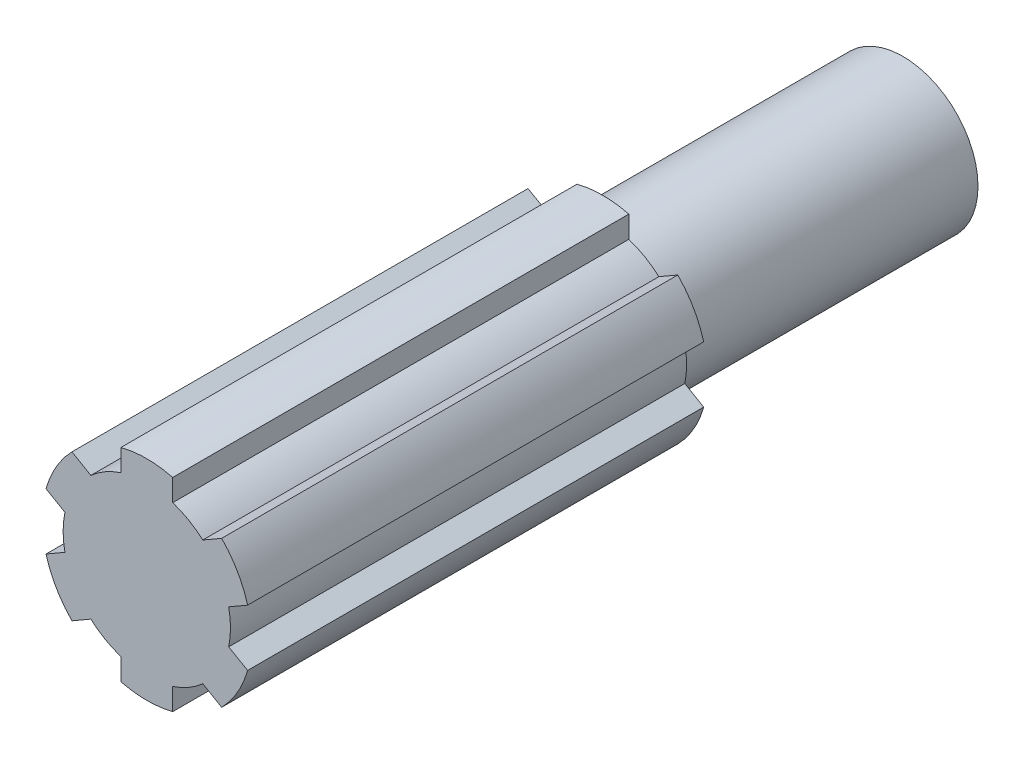
ISO-10303-21;
HEADER;
FILE_DESCRIPTION(('STEP AP214'),'2;1');
FILE_NAME('part.step','',(''),(''),'','','');
FILE_SCHEMA(('AUTOMOTIVE_DESIGN { 1 0 10303 214 1 1 1 1 }'));
ENDSEC;
DATA;
#1=APPLICATION_CONTEXT('core data for automotive mechanical design processes');
#2=APPLICATION_PROTOCOL_DEFINITION('international standard','automotive_design',2000,#1);
#3=PRODUCT_CONTEXT('',#1,'mechanical');
#4=PRODUCT('Part','Part','',(#3));
#5=PRODUCT_RELATED_PRODUCT_CATEGORY('part','',(#4));
#6=PRODUCT_DEFINITION_FORMATION('','',#4);
#7=PRODUCT_DEFINITION_CONTEXT('part definition',#1,'design');
#8=PRODUCT_DEFINITION('design','',#6,#7);
#9=PRODUCT_DEFINITION_SHAPE('','',#8);
#10=(LENGTH_UNIT() NAMED_UNIT(*) SI_UNIT(.MILLI.,.METRE.));
#11=(NAMED_UNIT(*) PLANE_ANGLE_UNIT() SI_UNIT($,.RADIAN.));
#12=(NAMED_UNIT(*) SI_UNIT($,.STERADIAN.) SOLID_ANGLE_UNIT());
#13=UNCERTAINTY_MEASURE_WITH_UNIT(LENGTH_MEASURE(1.E-05),#10,'distance_accuracy_value','');
#14=(GEOMETRIC_REPRESENTATION_CONTEXT(3) GLOBAL_UNCERTAINTY_ASSIGNED_CONTEXT((#13)) GLOBAL_UNIT_ASSIGNED_CONTEXT((#10,
#11,#12)) REPRESENTATION_CONTEXT('',''));
#15=CARTESIAN_POINT('',(0.,0.,0.));
#16=DIRECTION('',(0.,0.,1.));
#17=DIRECTION('',(1.,0.,0.));
#18=AXIS2_PLACEMENT_3D('',#15,#16,#17);
#19=CARTESIAN_POINT('',(0.,0.,50.));
#20=DIRECTION('',(0.,0.,-1.));
#21=DIRECTION('',(-1.,0.,0.));
#22=AXIS2_PLACEMENT_3D('',#19,#20,#21);
#23=CYLINDRICAL_SURFACE('',#22,12.5);
#24=CARTESIAN_POINT('',(0.,0.,50.));
#25=DIRECTION('',(0.,0.,1.));
#26=DIRECTION('',(1.,0.,0.));
#27=AXIS2_PLACEMENT_3D('',#24,#25,#26);
#28=CIRCLE('',#27,12.5);
#29=CARTESIAN_POINT('',(12.5,0.,50.));
#30=VERTEX_POINT('',#29);
#31=EDGE_CURVE('E11',#30,#30,#28,.T.);
#32=ORIENTED_EDGE('',*,*,#31,.F.);
#33=EDGE_LOOP('',(#32));
#34=FACE_BOUND('',#33,.T.);
#35=CARTESIAN_POINT('',(0.,0.,0.));
#36=DIRECTION('',(0.,0.,1.));
#37=DIRECTION('',(1.,0.,0.));
#38=AXIS2_PLACEMENT_3D('',#35,#36,#37);
#39=CIRCLE('',#38,12.5);
#40=CARTESIAN_POINT('',(12.5,0.,0.));
#41=VERTEX_POINT('',#40);
#42=EDGE_CURVE('E36',#41,#41,#39,.T.);
#43=ORIENTED_EDGE('',*,*,#42,.T.);
#44=EDGE_LOOP('',(#43));
#45=FACE_BOUND('',#44,.T.);
#46=ADVANCED_FACE('F33',(#34,#45),#23,.T.);
#47=CARTESIAN_POINT('',(0.,0.,0.));
#48=DIRECTION('',(0.,0.,1.));
#49=DIRECTION('',(1.,0.,0.));
#50=AXIS2_PLACEMENT_3D('',#47,#48,#49);
#51=PLANE('',#50);
#52=ORIENTED_EDGE('',*,*,#42,.F.);
#53=EDGE_LOOP('',(#52));
#54=FACE_BOUND('',#53,.T.);
#55=ADVANCED_FACE('F339',(#54),#51,.F.);
#56=CARTESIAN_POINT('',(0.,0.,126.));
#57=DIRECTION('',(0.,0.,-1.));
#58=DIRECTION('',(-1.,0.,0.));
#59=AXIS2_PLACEMENT_3D('',#56,#57,#58);
#60=CYLINDRICAL_SURFACE('',#59,13.945);
#61=CARTESIAN_POINT('',(0.,0.,50.));
#62=DIRECTION('',(0.,0.,1.));
#63=DIRECTION('',(1.,0.,0.));
#64=AXIS2_PLACEMENT_3D('',#61,#62,#63);
#65=CIRCLE('',#64,13.945);
#66=CARTESIAN_POINT('',(9.32261593671059,10.3707211464097,50.));
#67=VERTEX_POINT('',#66);
#68=CARTESIAN_POINT('',(4.32,13.2589828041219,50.));
#69=VERTEX_POINT('',#68);
#70=EDGE_CURVE('E226',#67,#69,#65,.T.);
#71=ORIENTED_EDGE('',*,*,#70,.T.);
#72=DIRECTION('',(0.,0.,-1.));
#73=VECTOR('',#72,1.);
#74=CARTESIAN_POINT('',(4.32,13.2589828041219,126.));
#75=LINE('',#74,#73);
#76=CARTESIAN_POINT('',(4.32,13.2589828041219,126.));
#77=VERTEX_POINT('',#76);
#78=EDGE_CURVE('E333',#77,#69,#75,.T.);
#79=ORIENTED_EDGE('',*,*,#78,.F.);
#80=CARTESIAN_POINT('',(0.,0.,126.));
#81=DIRECTION('',(0.,0.,1.));
#82=DIRECTION('',(1.,0.,0.));
#83=AXIS2_PLACEMENT_3D('',#80,#81,#82);
#84=CIRCLE('',#83,13.945);
#85=CARTESIAN_POINT('',(9.32261593671059,10.3707211464097,126.));
#86=VERTEX_POINT('',#85);
#87=EDGE_CURVE('E272',#86,#77,#84,.T.);
#88=ORIENTED_EDGE('',*,*,#87,.F.);
#89=DIRECTION('',(0.,0.,-1.));
#90=VECTOR('',#89,1.);
#91=CARTESIAN_POINT('',(9.32261593671059,10.3707211464097,126.));
#92=LINE('',#91,#90);
#93=EDGE_CURVE('E222',#86,#67,#92,.T.);
#94=ORIENTED_EDGE('',*,*,#93,.T.);
#95=EDGE_LOOP('',(#71,#79,#88,#94));
#96=FACE_BOUND('',#95,.T.);
#97=ADVANCED_FACE('F341',(#96),#60,.T.);
#98=CARTESIAN_POINT('',(4.32,16.9016456299379,126.));
#99=DIRECTION('',(-1.,0.,0.));
#100=DIRECTION('',(0.,-1.,0.));
#101=AXIS2_PLACEMENT_3D('',#98,#99,#100);
#102=PLANE('',#101);
#103=DIRECTION('',(0.,1.,0.));
#104=VECTOR('',#103,1.);
#105=CARTESIAN_POINT('',(4.32,16.9016456299379,50.));
#106=LINE('',#105,#104);
#107=CARTESIAN_POINT('',(4.32,16.9016456299379,50.));
#108=VERTEX_POINT('',#107);
#109=EDGE_CURVE('E229',#69,#108,#106,.T.);
#110=ORIENTED_EDGE('',*,*,#109,.T.);
#111=DIRECTION('',(0.,0.,-1.));
#112=VECTOR('',#111,1.);
#113=CARTESIAN_POINT('',(4.32,16.9016456299379,126.));
#114=LINE('',#113,#112);
#115=CARTESIAN_POINT('',(4.32,16.9016456299379,126.));
#116=VERTEX_POINT('',#115);
#117=EDGE_CURVE('E330',#116,#108,#114,.T.);
#118=ORIENTED_EDGE('',*,*,#117,.F.);
#119=DIRECTION('',(0.,1.,0.));
#120=VECTOR('',#119,1.);
#121=CARTESIAN_POINT('',(4.32,16.9016456299379,126.));
#122=LINE('',#121,#120);
#123=EDGE_CURVE('E141',#77,#116,#122,.T.);
#124=ORIENTED_EDGE('',*,*,#123,.F.);
#125=ORIENTED_EDGE('',*,*,#78,.T.);
#126=EDGE_LOOP('',(#110,#118,#124,#125));
#127=FACE_BOUND('',#126,.T.);
#128=ADVANCED_FACE('F346',(#127),#102,.F.);
#129=CARTESIAN_POINT('',(0.,0.,126.));
#130=DIRECTION('',(0.,0.,-1.));
#131=DIRECTION('',(-1.,0.,0.));
#132=AXIS2_PLACEMENT_3D('',#129,#130,#131);
#133=CYLINDRICAL_SURFACE('',#132,17.445);
#134=CARTESIAN_POINT('',(0.,0.,50.));
#135=DIRECTION('',(0.,0.,1.));
#136=DIRECTION('',(1.,0.,0.));
#137=AXIS2_PLACEMENT_3D('',#134,#135,#136);
#138=CIRCLE('',#137,17.445);
#139=CARTESIAN_POINT('',(-4.32,16.9016456299379,50.));
#140=VERTEX_POINT('',#139);
#141=EDGE_CURVE('E231',#108,#140,#138,.T.);
#142=ORIENTED_EDGE('',*,*,#141,.T.);
#143=DIRECTION('',(0.,0.,-1.));
#144=VECTOR('',#143,1.);
#145=CARTESIAN_POINT('',(-4.32,16.9016456299379,126.));
#146=LINE('',#145,#144);
#147=CARTESIAN_POINT('',(-4.32,16.9016456299379,126.));
#148=VERTEX_POINT('',#147);
#149=EDGE_CURVE('E327',#148,#140,#146,.T.);
#150=ORIENTED_EDGE('',*,*,#149,.F.);
#151=CARTESIAN_POINT('',(0.,0.,126.));
#152=DIRECTION('',(0.,0.,1.));
#153=DIRECTION('',(1.,0.,0.));
#154=AXIS2_PLACEMENT_3D('',#151,#152,#153);
#155=CIRCLE('',#154,17.445);
#156=EDGE_CURVE('E613',#116,#148,#155,.T.);
#157=ORIENTED_EDGE('',*,*,#156,.F.);
#158=ORIENTED_EDGE('',*,*,#117,.T.);
#159=EDGE_LOOP('',(#142,#150,#157,#158));
#160=FACE_BOUND('',#159,.T.);
#161=ADVANCED_FACE('F353',(#160),#133,.T.);
#162=CARTESIAN_POINT('',(-4.32,13.2589828041219,126.));
#163=DIRECTION('',(1.,0.,0.));
#164=DIRECTION('',(0.,0.,-1.));
#165=AXIS2_PLACEMENT_3D('',#162,#163,#164);
#166=PLANE('',#165);
#167=DIRECTION('',(0.,-1.,0.));
#168=VECTOR('',#167,1.);
#169=CARTESIAN_POINT('',(-4.32,13.2589828041219,50.));
#170=LINE('',#169,#168);
#171=CARTESIAN_POINT('',(-4.32,13.2589828041219,50.));
#172=VERTEX_POINT('',#171);
#173=EDGE_CURVE('E233',#140,#172,#170,.T.);
#174=ORIENTED_EDGE('',*,*,#173,.T.);
#175=DIRECTION('',(0.,0.,-1.));
#176=VECTOR('',#175,1.);
#177=CARTESIAN_POINT('',(-4.32,13.2589828041219,126.));
#178=LINE('',#177,#176);
#179=CARTESIAN_POINT('',(-4.32,13.2589828041219,126.));
#180=VERTEX_POINT('',#179);
#181=EDGE_CURVE('E324',#180,#172,#178,.T.);
#182=ORIENTED_EDGE('',*,*,#181,.F.);
#183=DIRECTION('',(0.,-1.,0.));
#184=VECTOR('',#183,1.);
#185=CARTESIAN_POINT('',(-4.32,13.2589828041219,126.));
#186=LINE('',#185,#184);
#187=EDGE_CURVE('E617',#148,#180,#186,.T.);
#188=ORIENTED_EDGE('',*,*,#187,.F.);
#189=ORIENTED_EDGE('',*,*,#149,.T.);
#190=EDGE_LOOP('',(#174,#182,#188,#189));
#191=FACE_BOUND('',#190,.T.);
#192=ADVANCED_FACE('F356',(#191),#166,.F.);
#193=CARTESIAN_POINT('',(0.,0.,126.));
#194=DIRECTION('',(0.,0.,-1.));
#195=DIRECTION('',(-1.,0.,0.));
#196=AXIS2_PLACEMENT_3D('',#193,#194,#195);
#197=CYLINDRICAL_SURFACE('',#196,13.945);
#198=CARTESIAN_POINT('',(0.,0.,50.));
#199=DIRECTION('',(0.,0.,1.));
#200=DIRECTION('',(1.,0.,0.));
#201=AXIS2_PLACEMENT_3D('',#198,#199,#200);
#202=CIRCLE('',#201,13.945);
#203=CARTESIAN_POINT('',(-9.3226159367106,10.3707211464097,50.));
#204=VERTEX_POINT('',#203);
#205=EDGE_CURVE('E235',#172,#204,#202,.T.);
#206=ORIENTED_EDGE('',*,*,#205,.T.);
#207=DIRECTION('',(0.,0.,-1.));
#208=VECTOR('',#207,1.);
#209=CARTESIAN_POINT('',(-9.3226159367106,10.3707211464097,126.));
#210=LINE('',#209,#208);
#211=CARTESIAN_POINT('',(-9.3226159367106,10.3707211464097,126.));
#212=VERTEX_POINT('',#211);
#213=EDGE_CURVE('E321',#212,#204,#210,.T.);
#214=ORIENTED_EDGE('',*,*,#213,.F.);
#215=CARTESIAN_POINT('',(0.,0.,126.));
#216=DIRECTION('',(0.,0.,1.));
#217=DIRECTION('',(1.,0.,0.));
#218=AXIS2_PLACEMENT_3D('',#215,#216,#217);
#219=CIRCLE('',#218,13.945);
#220=EDGE_CURVE('E619',#180,#212,#219,.T.);
#221=ORIENTED_EDGE('',*,*,#220,.F.);
#222=ORIENTED_EDGE('',*,*,#181,.T.);
#223=EDGE_LOOP('',(#206,#214,#221,#222));
#224=FACE_BOUND('',#223,.T.);
#225=ADVANCED_FACE('F360',(#224),#197,.T.);
#226=CARTESIAN_POINT('',(-12.4772544812885,12.1920525593178,126.));
#227=DIRECTION('',(-0.500000000000008,-0.866025403784434,0.));
#228=DIRECTION('',(0.866025403784434,-0.500000000000008,0.));
#229=AXIS2_PLACEMENT_3D('',#226,#227,#228);
#230=PLANE('',#229);
#231=DIRECTION('',(-0.866025403784434,0.500000000000008,0.));
#232=VECTOR('',#231,1.);
#233=CARTESIAN_POINT('',(-12.4772544812885,12.1920525593178,50.));
#234=LINE('',#233,#232);
#235=CARTESIAN_POINT('',(-12.4772544812885,12.1920525593178,50.));
#236=VERTEX_POINT('',#235);
#237=EDGE_CURVE('E237',#204,#236,#234,.T.);
#238=ORIENTED_EDGE('',*,*,#237,.T.);
#239=DIRECTION('',(0.,0.,-1.));
#240=VECTOR('',#239,1.);
#241=CARTESIAN_POINT('',(-12.4772544812885,12.1920525593178,126.));
#242=LINE('',#241,#240);
#243=CARTESIAN_POINT('',(-12.4772544812885,12.1920525593178,126.));
#244=VERTEX_POINT('',#243);
#245=EDGE_CURVE('E318',#244,#236,#242,.T.);
#246=ORIENTED_EDGE('',*,*,#245,.F.);
#247=DIRECTION('',(-0.866025403784434,0.500000000000008,0.));
#248=VECTOR('',#247,1.);
#249=CARTESIAN_POINT('',(-12.4772544812885,12.1920525593178,126.));
#250=LINE('',#249,#248);
#251=EDGE_CURVE('E621',#212,#244,#250,.T.);
#252=ORIENTED_EDGE('',*,*,#251,.F.);
#253=ORIENTED_EDGE('',*,*,#213,.T.);
#254=EDGE_LOOP('',(#238,#246,#252,#253));
#255=FACE_BOUND('',#254,.T.);
#256=ADVANCED_FACE('F364',(#255),#230,.F.);
#257=CARTESIAN_POINT('',(0.,0.,126.));
#258=DIRECTION('',(0.,0.,-1.));
#259=DIRECTION('',(-1.,0.,0.));
#260=AXIS2_PLACEMENT_3D('',#257,#258,#259);
#261=CYLINDRICAL_SURFACE('',#260,17.445);
#262=CARTESIAN_POINT('',(0.,0.,50.));
#263=DIRECTION('',(0.,0.,1.));
#264=DIRECTION('',(1.,0.,0.));
#265=AXIS2_PLACEMENT_3D('',#262,#263,#264);
#266=CIRCLE('',#265,17.445);
#267=CARTESIAN_POINT('',(-16.7972544812885,4.70959307062018,50.));
#268=VERTEX_POINT('',#267);
#269=EDGE_CURVE('E239',#236,#268,#266,.T.);
#270=ORIENTED_EDGE('',*,*,#269,.T.);
#271=DIRECTION('',(0.,0.,-1.));
#272=VECTOR('',#271,1.);
#273=CARTESIAN_POINT('',(-16.7972544812885,4.70959307062018,126.));
#274=LINE('',#273,#272);
#275=CARTESIAN_POINT('',(-16.7972544812885,4.70959307062018,126.));
#276=VERTEX_POINT('',#275);
#277=EDGE_CURVE('E315',#276,#268,#274,.T.);
#278=ORIENTED_EDGE('',*,*,#277,.F.);
#279=CARTESIAN_POINT('',(0.,0.,126.));
#280=DIRECTION('',(0.,0.,1.));
#281=DIRECTION('',(1.,0.,0.));
#282=AXIS2_PLACEMENT_3D('',#279,#280,#281);
#283=CIRCLE('',#282,17.445);
#284=EDGE_CURVE('E623',#244,#276,#283,.T.);
#285=ORIENTED_EDGE('',*,*,#284,.F.);
#286=ORIENTED_EDGE('',*,*,#245,.T.);
#287=EDGE_LOOP('',(#270,#278,#285,#286));
#288=FACE_BOUND('',#287,.T.);
#289=ADVANCED_FACE('F368',(#288),#261,.T.);
#290=CARTESIAN_POINT('',(-13.6426159367106,2.88826165771216,126.));
#291=DIRECTION('',(0.499999999999999,0.866025403784439,0.));
#292=DIRECTION('',(-0.866025403784439,0.499999999999999,0.));
#293=AXIS2_PLACEMENT_3D('',#290,#291,#292);
#294=PLANE('',#293);
#295=DIRECTION('',(0.866025403784439,-0.499999999999999,0.));
#296=VECTOR('',#295,1.);
#297=CARTESIAN_POINT('',(-13.6426159367106,2.88826165771216,50.));
#298=LINE('',#297,#296);
#299=CARTESIAN_POINT('',(-13.6426159367106,2.88826165771216,50.));
#300=VERTEX_POINT('',#299);
#301=EDGE_CURVE('E241',#268,#300,#298,.T.);
#302=ORIENTED_EDGE('',*,*,#301,.T.);
#303=DIRECTION('',(0.,0.,-1.));
#304=VECTOR('',#303,1.);
#305=CARTESIAN_POINT('',(-13.6426159367106,2.88826165771216,126.));
#306=LINE('',#305,#304);
#307=CARTESIAN_POINT('',(-13.6426159367106,2.88826165771216,126.));
#308=VERTEX_POINT('',#307);
#309=EDGE_CURVE('E312',#308,#300,#306,.T.);
#310=ORIENTED_EDGE('',*,*,#309,.F.);
#311=DIRECTION('',(0.866025403784439,-0.499999999999999,0.));
#312=VECTOR('',#311,1.);
#313=CARTESIAN_POINT('',(-13.6426159367106,2.88826165771216,126.));
#314=LINE('',#313,#312);
#315=EDGE_CURVE('E625',#276,#308,#314,.T.);
#316=ORIENTED_EDGE('',*,*,#315,.F.);
#317=ORIENTED_EDGE('',*,*,#277,.T.);
#318=EDGE_LOOP('',(#302,#310,#316,#317));
#319=FACE_BOUND('',#318,.T.);
#320=ADVANCED_FACE('F372',(#319),#294,.F.);
#321=CARTESIAN_POINT('',(0.,0.,126.));
#322=DIRECTION('',(0.,0.,-1.));
#323=DIRECTION('',(-1.,0.,0.));
#324=AXIS2_PLACEMENT_3D('',#321,#322,#323);
#325=CYLINDRICAL_SURFACE('',#324,13.945);
#326=CARTESIAN_POINT('',(0.,0.,50.));
#327=DIRECTION('',(0.,0.,1.));
#328=DIRECTION('',(1.,0.,0.));
#329=AXIS2_PLACEMENT_3D('',#326,#327,#328);
#330=CIRCLE('',#329,13.945);
#331=CARTESIAN_POINT('',(-13.6426159367106,-2.88826165771218,50.));
#332=VERTEX_POINT('',#331);
#333=EDGE_CURVE('E243',#300,#332,#330,.T.);
#334=ORIENTED_EDGE('',*,*,#333,.T.);
#335=DIRECTION('',(0.,0.,-1.));
#336=VECTOR('',#335,1.);
#337=CARTESIAN_POINT('',(-13.6426159367106,-2.88826165771218,126.));
#338=LINE('',#337,#336);
#339=CARTESIAN_POINT('',(-13.6426159367106,-2.88826165771218,126.));
#340=VERTEX_POINT('',#339);
#341=EDGE_CURVE('E309',#340,#332,#338,.T.);
#342=ORIENTED_EDGE('',*,*,#341,.F.);
#343=CARTESIAN_POINT('',(0.,0.,126.));
#344=DIRECTION('',(0.,0.,1.));
#345=DIRECTION('',(1.,0.,0.));
#346=AXIS2_PLACEMENT_3D('',#343,#344,#345);
#347=CIRCLE('',#346,13.945);
#348=EDGE_CURVE('E627',#308,#340,#347,.T.);
#349=ORIENTED_EDGE('',*,*,#348,.F.);
#350=ORIENTED_EDGE('',*,*,#309,.T.);
#351=EDGE_LOOP('',(#334,#342,#349,#350));
#352=FACE_BOUND('',#351,.T.);
#353=ADVANCED_FACE('F376',(#352),#325,.T.);
#354=CARTESIAN_POINT('',(-16.7972544812885,-4.7095930706202,126.));
#355=DIRECTION('',(0.499999999999999,-0.866025403784439,0.));
#356=DIRECTION('',(0.866025403784439,0.499999999999999,0.));
#357=AXIS2_PLACEMENT_3D('',#354,#355,#356);
#358=PLANE('',#357);
#359=DIRECTION('',(-0.866025403784439,-0.499999999999999,0.));
#360=VECTOR('',#359,1.);
#361=CARTESIAN_POINT('',(-16.7972544812885,-4.7095930706202,50.));
#362=LINE('',#361,#360);
#363=CARTESIAN_POINT('',(-16.7972544812885,-4.70959307062019,50.));
#364=VERTEX_POINT('',#363);
#365=EDGE_CURVE('E245',#332,#364,#362,.T.);
#366=ORIENTED_EDGE('',*,*,#365,.T.);
#367=DIRECTION('',(0.,0.,-1.));
#368=VECTOR('',#367,1.);
#369=CARTESIAN_POINT('',(-16.7972544812885,-4.70959307062019,126.));
#370=LINE('',#369,#368);
#371=CARTESIAN_POINT('',(-16.7972544812885,-4.70959307062019,126.));
#372=VERTEX_POINT('',#371);
#373=EDGE_CURVE('E306',#372,#364,#370,.T.);
#374=ORIENTED_EDGE('',*,*,#373,.F.);
#375=DIRECTION('',(-0.866025403784439,-0.499999999999999,0.));
#376=VECTOR('',#375,1.);
#377=CARTESIAN_POINT('',(-16.7972544812885,-4.7095930706202,126.));
#378=LINE('',#377,#376);
#379=EDGE_CURVE('E629',#340,#372,#378,.T.);
#380=ORIENTED_EDGE('',*,*,#379,.F.);
#381=ORIENTED_EDGE('',*,*,#341,.T.);
#382=EDGE_LOOP('',(#366,#374,#380,#381));
#383=FACE_BOUND('',#382,.T.);
#384=ADVANCED_FACE('F380',(#383),#358,.F.);
#385=CARTESIAN_POINT('',(0.,0.,126.));
#386=DIRECTION('',(0.,0.,-1.));
#387=DIRECTION('',(-1.,0.,0.));
#388=AXIS2_PLACEMENT_3D('',#385,#386,#387);
#389=CYLINDRICAL_SURFACE('',#388,17.445);
#390=CARTESIAN_POINT('',(0.,0.,50.));
#391=DIRECTION('',(0.,0.,1.));
#392=DIRECTION('',(1.,0.,0.));
#393=AXIS2_PLACEMENT_3D('',#390,#391,#392);
#394=CIRCLE('',#393,17.445);
#395=CARTESIAN_POINT('',(-12.4772544812885,-12.1920525593177,50.));
#396=VERTEX_POINT('',#395);
#397=EDGE_CURVE('E247',#364,#396,#394,.T.);
#398=ORIENTED_EDGE('',*,*,#397,.T.);
#399=DIRECTION('',(0.,0.,-1.));
#400=VECTOR('',#399,1.);
#401=CARTESIAN_POINT('',(-12.4772544812885,-12.1920525593177,126.));
#402=LINE('',#401,#400);
#403=CARTESIAN_POINT('',(-12.4772544812885,-12.1920525593177,126.));
#404=VERTEX_POINT('',#403);
#405=EDGE_CURVE('E303',#404,#396,#402,.T.);
#406=ORIENTED_EDGE('',*,*,#405,.F.);
#407=CARTESIAN_POINT('',(0.,0.,126.));
#408=DIRECTION('',(0.,0.,1.));
#409=DIRECTION('',(1.,0.,0.));
#410=AXIS2_PLACEMENT_3D('',#407,#408,#409);
#411=CIRCLE('',#410,17.445);
#412=EDGE_CURVE('E631',#372,#404,#411,.T.);
#413=ORIENTED_EDGE('',*,*,#412,.F.);
#414=ORIENTED_EDGE('',*,*,#373,.T.);
#415=EDGE_LOOP('',(#398,#406,#413,#414));
#416=FACE_BOUND('',#415,.T.);
#417=ADVANCED_FACE('F384',(#416),#389,.T.);
#418=CARTESIAN_POINT('',(-9.32261593671059,-10.3707211464097,126.));
#419=DIRECTION('',(-0.500000000000001,0.866025403784438,0.));
#420=DIRECTION('',(-0.866025403784438,-0.500000000000001,0.));
#421=AXIS2_PLACEMENT_3D('',#418,#419,#420);
#422=PLANE('',#421);
#423=DIRECTION('',(0.866025403784438,0.500000000000001,0.));
#424=VECTOR('',#423,1.);
#425=CARTESIAN_POINT('',(-9.32261593671059,-10.3707211464097,50.));
#426=LINE('',#425,#424);
#427=CARTESIAN_POINT('',(-9.32261593671059,-10.3707211464097,50.));
#428=VERTEX_POINT('',#427);
#429=EDGE_CURVE('E249',#396,#428,#426,.T.);
#430=ORIENTED_EDGE('',*,*,#429,.T.);
#431=DIRECTION('',(0.,0.,-1.));
#432=VECTOR('',#431,1.);
#433=CARTESIAN_POINT('',(-9.32261593671059,-10.3707211464097,126.));
#434=LINE('',#433,#432);
#435=CARTESIAN_POINT('',(-9.32261593671059,-10.3707211464097,126.));
#436=VERTEX_POINT('',#435);
#437=EDGE_CURVE('E300',#436,#428,#434,.T.);
#438=ORIENTED_EDGE('',*,*,#437,.F.);
#439=DIRECTION('',(0.866025403784438,0.500000000000001,0.));
#440=VECTOR('',#439,1.);
#441=CARTESIAN_POINT('',(-9.32261593671059,-10.3707211464097,126.));
#442=LINE('',#441,#440);
#443=EDGE_CURVE('E633',#404,#436,#442,.T.);
#444=ORIENTED_EDGE('',*,*,#443,.F.);
#445=ORIENTED_EDGE('',*,*,#405,.T.);
#446=EDGE_LOOP('',(#430,#438,#444,#445));
#447=FACE_BOUND('',#446,.T.);
#448=ADVANCED_FACE('F388',(#447),#422,.F.);
#449=CARTESIAN_POINT('',(0.,0.,126.));
#450=DIRECTION('',(0.,0.,-1.));
#451=DIRECTION('',(-1.,0.,0.));
#452=AXIS2_PLACEMENT_3D('',#449,#450,#451);
#453=CYLINDRICAL_SURFACE('',#452,13.945);
#454=CARTESIAN_POINT('',(0.,0.,50.));
#455=DIRECTION('',(0.,0.,1.));
#456=DIRECTION('',(1.,0.,0.));
#457=AXIS2_PLACEMENT_3D('',#454,#455,#456);
#458=CIRCLE('',#457,13.945);
#459=CARTESIAN_POINT('',(-4.31999999999999,-13.2589828041219,50.));
#460=VERTEX_POINT('',#459);
#461=EDGE_CURVE('E251',#428,#460,#458,.T.);
#462=ORIENTED_EDGE('',*,*,#461,.T.);
#463=DIRECTION('',(0.,0.,-1.));
#464=VECTOR('',#463,1.);
#465=CARTESIAN_POINT('',(-4.31999999999999,-13.2589828041219,126.));
#466=LINE('',#465,#464);
#467=CARTESIAN_POINT('',(-4.31999999999999,-13.2589828041219,126.));
#468=VERTEX_POINT('',#467);
#469=EDGE_CURVE('E297',#468,#460,#466,.T.);
#470=ORIENTED_EDGE('',*,*,#469,.F.);
#471=CARTESIAN_POINT('',(0.,0.,126.));
#472=DIRECTION('',(0.,0.,1.));
#473=DIRECTION('',(1.,0.,0.));
#474=AXIS2_PLACEMENT_3D('',#471,#472,#473);
#475=CIRCLE('',#474,13.945);
#476=EDGE_CURVE('E635',#436,#468,#475,.T.);
#477=ORIENTED_EDGE('',*,*,#476,.F.);
#478=ORIENTED_EDGE('',*,*,#437,.T.);
#479=EDGE_LOOP('',(#462,#470,#477,#478));
#480=FACE_BOUND('',#479,.T.);
#481=ADVANCED_FACE('F392',(#480),#453,.T.);
#482=CARTESIAN_POINT('',(-4.32,-16.9016456299379,126.));
#483=DIRECTION('',(1.,0.,0.));
#484=DIRECTION('',(0.,1.,0.));
#485=AXIS2_PLACEMENT_3D('',#482,#483,#484);
#486=PLANE('',#485);
#487=DIRECTION('',(0.,-1.,0.));
#488=VECTOR('',#487,1.);
#489=CARTESIAN_POINT('',(-4.32,-16.9016456299379,50.));
#490=LINE('',#489,#488);
#491=CARTESIAN_POINT('',(-4.32000000000001,-16.9016456299379,50.));
#492=VERTEX_POINT('',#491);
#493=EDGE_CURVE('E253',#460,#492,#490,.T.);
#494=ORIENTED_EDGE('',*,*,#493,.T.);
#495=DIRECTION('',(0.,0.,-1.));
#496=VECTOR('',#495,1.);
#497=CARTESIAN_POINT('',(-4.32000000000001,-16.9016456299379,126.));
#498=LINE('',#497,#496);
#499=CARTESIAN_POINT('',(-4.32000000000001,-16.9016456299379,126.));
#500=VERTEX_POINT('',#499);
#501=EDGE_CURVE('E294',#500,#492,#498,.T.);
#502=ORIENTED_EDGE('',*,*,#501,.F.);
#503=DIRECTION('',(0.,-1.,0.));
#504=VECTOR('',#503,1.);
#505=CARTESIAN_POINT('',(-4.32,-16.9016456299379,126.));
#506=LINE('',#505,#504);
#507=EDGE_CURVE('E637',#468,#500,#506,.T.);
#508=ORIENTED_EDGE('',*,*,#507,.F.);
#509=ORIENTED_EDGE('',*,*,#469,.T.);
#510=EDGE_LOOP('',(#494,#502,#508,#509));
#511=FACE_BOUND('',#510,.T.);
#512=ADVANCED_FACE('F396',(#511),#486,.F.);
#513=CARTESIAN_POINT('',(0.,0.,126.));
#514=DIRECTION('',(0.,0.,-1.));
#515=DIRECTION('',(-1.,0.,0.));
#516=AXIS2_PLACEMENT_3D('',#513,#514,#515);
#517=CYLINDRICAL_SURFACE('',#516,17.445);
#518=CARTESIAN_POINT('',(0.,0.,50.));
#519=DIRECTION('',(0.,0.,1.));
#520=DIRECTION('',(1.,0.,0.));
#521=AXIS2_PLACEMENT_3D('',#518,#519,#520);
#522=CIRCLE('',#521,17.445);
#523=CARTESIAN_POINT('',(4.32,-16.9016456299379,50.));
#524=VERTEX_POINT('',#523);
#525=EDGE_CURVE('E255',#492,#524,#522,.T.);
#526=ORIENTED_EDGE('',*,*,#525,.T.);
#527=DIRECTION('',(0.,0.,-1.));
#528=VECTOR('',#527,1.);
#529=CARTESIAN_POINT('',(4.32,-16.9016456299379,126.));
#530=LINE('',#529,#528);
#531=CARTESIAN_POINT('',(4.32,-16.9016456299379,126.));
#532=VERTEX_POINT('',#531);
#533=EDGE_CURVE('E291',#532,#524,#530,.T.);
#534=ORIENTED_EDGE('',*,*,#533,.F.);
#535=CARTESIAN_POINT('',(0.,0.,126.));
#536=DIRECTION('',(0.,0.,1.));
#537=DIRECTION('',(1.,0.,0.));
#538=AXIS2_PLACEMENT_3D('',#535,#536,#537);
#539=CIRCLE('',#538,17.445);
#540=EDGE_CURVE('E639',#500,#532,#539,.T.);
#541=ORIENTED_EDGE('',*,*,#540,.F.);
#542=ORIENTED_EDGE('',*,*,#501,.T.);
#543=EDGE_LOOP('',(#526,#534,#541,#542));
#544=FACE_BOUND('',#543,.T.);
#545=ADVANCED_FACE('F400',(#544),#517,.T.);
#546=CARTESIAN_POINT('',(4.32,-13.2589828041219,126.));
#547=DIRECTION('',(-1.,0.,0.));
#548=DIRECTION('',(0.,-1.,0.));
#549=AXIS2_PLACEMENT_3D('',#546,#547,#548);
#550=PLANE('',#549);
#551=DIRECTION('',(0.,1.,0.));
#552=VECTOR('',#551,1.);
#553=CARTESIAN_POINT('',(4.32,-13.2589828041219,50.));
#554=LINE('',#553,#552);
#555=CARTESIAN_POINT('',(4.32,-13.2589828041219,50.));
#556=VERTEX_POINT('',#555);
#557=EDGE_CURVE('E257',#524,#556,#554,.T.);
#558=ORIENTED_EDGE('',*,*,#557,.T.);
#559=DIRECTION('',(0.,0.,-1.));
#560=VECTOR('',#559,1.);
#561=CARTESIAN_POINT('',(4.32,-13.2589828041219,126.));
#562=LINE('',#561,#560);
#563=CARTESIAN_POINT('',(4.32,-13.2589828041219,126.));
#564=VERTEX_POINT('',#563);
#565=EDGE_CURVE('E288',#564,#556,#562,.T.);
#566=ORIENTED_EDGE('',*,*,#565,.F.);
#567=DIRECTION('',(0.,1.,0.));
#568=VECTOR('',#567,1.);
#569=CARTESIAN_POINT('',(4.32,-13.2589828041219,126.));
#570=LINE('',#569,#568);
#571=EDGE_CURVE('E641',#532,#564,#570,.T.);
#572=ORIENTED_EDGE('',*,*,#571,.F.);
#573=ORIENTED_EDGE('',*,*,#533,.T.);
#574=EDGE_LOOP('',(#558,#566,#572,#573));
#575=FACE_BOUND('',#574,.T.);
#576=ADVANCED_FACE('F404',(#575),#550,.F.);
#577=CARTESIAN_POINT('',(0.,0.,126.));
#578=DIRECTION('',(0.,0.,-1.));
#579=DIRECTION('',(-1.,0.,0.));
#580=AXIS2_PLACEMENT_3D('',#577,#578,#579);
#581=CYLINDRICAL_SURFACE('',#580,13.945);
#582=CARTESIAN_POINT('',(0.,0.,50.));
#583=DIRECTION('',(0.,0.,1.));
#584=DIRECTION('',(1.,0.,0.));
#585=AXIS2_PLACEMENT_3D('',#582,#583,#584);
#586=CIRCLE('',#585,13.945);
#587=CARTESIAN_POINT('',(9.3226159367106,-10.3707211464097,50.));
#588=VERTEX_POINT('',#587);
#589=EDGE_CURVE('E259',#556,#588,#586,.T.);
#590=ORIENTED_EDGE('',*,*,#589,.T.);
#591=DIRECTION('',(0.,0.,-1.));
#592=VECTOR('',#591,1.);
#593=CARTESIAN_POINT('',(9.3226159367106,-10.3707211464097,126.));
#594=LINE('',#593,#592);
#595=CARTESIAN_POINT('',(9.3226159367106,-10.3707211464097,126.));
#596=VERTEX_POINT('',#595);
#597=EDGE_CURVE('E285',#596,#588,#594,.T.);
#598=ORIENTED_EDGE('',*,*,#597,.F.);
#599=CARTESIAN_POINT('',(0.,0.,126.));
#600=DIRECTION('',(0.,0.,1.));
#601=DIRECTION('',(1.,0.,0.));
#602=AXIS2_PLACEMENT_3D('',#599,#600,#601);
#603=CIRCLE('',#602,13.945);
#604=EDGE_CURVE('E643',#564,#596,#603,.T.);
#605=ORIENTED_EDGE('',*,*,#604,.F.);
#606=ORIENTED_EDGE('',*,*,#565,.T.);
#607=EDGE_LOOP('',(#590,#598,#605,#606));
#608=FACE_BOUND('',#607,.T.);
#609=ADVANCED_FACE('F408',(#608),#581,.T.);
#610=CARTESIAN_POINT('',(12.4772544812885,-12.1920525593177,126.));
#611=DIRECTION('',(0.500000000000001,0.866025403784438,0.));
#612=DIRECTION('',(-0.866025403784438,0.500000000000001,0.));
#613=AXIS2_PLACEMENT_3D('',#610,#611,#612);
#614=PLANE('',#613);
#615=DIRECTION('',(0.866025403784438,-0.500000000000001,0.));
#616=VECTOR('',#615,1.);
#617=CARTESIAN_POINT('',(12.4772544812885,-12.1920525593177,50.));
#618=LINE('',#617,#616);
#619=CARTESIAN_POINT('',(12.4772544812885,-12.1920525593177,50.));
#620=VERTEX_POINT('',#619);
#621=EDGE_CURVE('E261',#588,#620,#618,.T.);
#622=ORIENTED_EDGE('',*,*,#621,.T.);
#623=DIRECTION('',(0.,0.,-1.));
#624=VECTOR('',#623,1.);
#625=CARTESIAN_POINT('',(12.4772544812885,-12.1920525593177,126.));
#626=LINE('',#625,#624);
#627=CARTESIAN_POINT('',(12.4772544812885,-12.1920525593177,126.));
#628=VERTEX_POINT('',#627);
#629=EDGE_CURVE('E282',#628,#620,#626,.T.);
#630=ORIENTED_EDGE('',*,*,#629,.F.);
#631=DIRECTION('',(0.866025403784438,-0.500000000000001,0.));
#632=VECTOR('',#631,1.);
#633=CARTESIAN_POINT('',(12.4772544812885,-12.1920525593177,126.));
#634=LINE('',#633,#632);
#635=EDGE_CURVE('E645',#596,#628,#634,.T.);
#636=ORIENTED_EDGE('',*,*,#635,.F.);
#637=ORIENTED_EDGE('',*,*,#597,.T.);
#638=EDGE_LOOP('',(#622,#630,#636,#637));
#639=FACE_BOUND('',#638,.T.);
#640=ADVANCED_FACE('F412',(#639),#614,.F.);
#641=CARTESIAN_POINT('',(0.,0.,126.));
#642=DIRECTION('',(0.,0.,-1.));
#643=DIRECTION('',(-1.,0.,0.));
#644=AXIS2_PLACEMENT_3D('',#641,#642,#643);
#645=CYLINDRICAL_SURFACE('',#644,17.445);
#646=CARTESIAN_POINT('',(0.,0.,50.));
#647=DIRECTION('',(0.,0.,1.));
#648=DIRECTION('',(1.,0.,0.));
#649=AXIS2_PLACEMENT_3D('',#646,#647,#648);
#650=CIRCLE('',#649,17.445);
#651=CARTESIAN_POINT('',(16.7972544812885,-4.70959307062019,50.));
#652=VERTEX_POINT('',#651);
#653=EDGE_CURVE('E263',#620,#652,#650,.T.);
#654=ORIENTED_EDGE('',*,*,#653,.T.);
#655=DIRECTION('',(0.,0.,-1.));
#656=VECTOR('',#655,1.);
#657=CARTESIAN_POINT('',(16.7972544812885,-4.70959307062019,126.));
#658=LINE('',#657,#656);
#659=CARTESIAN_POINT('',(16.7972544812885,-4.70959307062019,126.));
#660=VERTEX_POINT('',#659);
#661=EDGE_CURVE('E279',#660,#652,#658,.T.);
#662=ORIENTED_EDGE('',*,*,#661,.F.);
#663=CARTESIAN_POINT('',(0.,0.,126.));
#664=DIRECTION('',(0.,0.,1.));
#665=DIRECTION('',(1.,0.,0.));
#666=AXIS2_PLACEMENT_3D('',#663,#664,#665);
#667=CIRCLE('',#666,17.445);
#668=EDGE_CURVE('E647',#628,#660,#667,.T.);
#669=ORIENTED_EDGE('',*,*,#668,.F.);
#670=ORIENTED_EDGE('',*,*,#629,.T.);
#671=EDGE_LOOP('',(#654,#662,#669,#670));
#672=FACE_BOUND('',#671,.T.);
#673=ADVANCED_FACE('F416',(#672),#645,.T.);
#674=CARTESIAN_POINT('',(13.6426159367106,-2.88826165771217,126.));
#675=DIRECTION('',(-0.499999999999999,-0.866025403784439,0.));
#676=DIRECTION('',(0.866025403784439,-0.499999999999999,0.));
#677=AXIS2_PLACEMENT_3D('',#674,#675,#676);
#678=PLANE('',#677);
#679=DIRECTION('',(-0.866025403784439,0.499999999999999,0.));
#680=VECTOR('',#679,1.);
#681=CARTESIAN_POINT('',(13.6426159367106,-2.88826165771217,50.));
#682=LINE('',#681,#680);
#683=CARTESIAN_POINT('',(13.6426159367106,-2.88826165771217,50.));
#684=VERTEX_POINT('',#683);
#685=EDGE_CURVE('E265',#652,#684,#682,.T.);
#686=ORIENTED_EDGE('',*,*,#685,.T.);
#687=DIRECTION('',(0.,0.,-1.));
#688=VECTOR('',#687,1.);
#689=CARTESIAN_POINT('',(13.6426159367106,-2.88826165771217,126.));
#690=LINE('',#689,#688);
#691=CARTESIAN_POINT('',(13.6426159367106,-2.88826165771217,126.));
#692=VERTEX_POINT('',#691);
#693=EDGE_CURVE('E276',#692,#684,#690,.T.);
#694=ORIENTED_EDGE('',*,*,#693,.F.);
#695=DIRECTION('',(-0.866025403784439,0.499999999999999,0.));
#696=VECTOR('',#695,1.);
#697=CARTESIAN_POINT('',(13.6426159367106,-2.88826165771217,126.));
#698=LINE('',#697,#696);
#699=EDGE_CURVE('E649',#660,#692,#698,.T.);
#700=ORIENTED_EDGE('',*,*,#699,.F.);
#701=ORIENTED_EDGE('',*,*,#661,.T.);
#702=EDGE_LOOP('',(#686,#694,#700,#701));
#703=FACE_BOUND('',#702,.T.);
#704=ADVANCED_FACE('F420',(#703),#678,.F.);
#705=CARTESIAN_POINT('',(0.,0.,126.));
#706=DIRECTION('',(0.,0.,-1.));
#707=DIRECTION('',(-1.,0.,0.));
#708=AXIS2_PLACEMENT_3D('',#705,#706,#707);
#709=CYLINDRICAL_SURFACE('',#708,13.945);
#710=CARTESIAN_POINT('',(0.,0.,50.));
#711=DIRECTION('',(0.,0.,1.));
#712=DIRECTION('',(1.,0.,0.));
#713=AXIS2_PLACEMENT_3D('',#710,#711,#712);
#714=CIRCLE('',#713,13.945);
#715=CARTESIAN_POINT('',(13.6426159367106,2.88826165771218,50.));
#716=VERTEX_POINT('',#715);
#717=EDGE_CURVE('E267',#684,#716,#714,.T.);
#718=ORIENTED_EDGE('',*,*,#717,.T.);
#719=DIRECTION('',(0.,0.,-1.));
#720=VECTOR('',#719,1.);
#721=CARTESIAN_POINT('',(13.6426159367106,2.88826165771218,126.));
#722=LINE('',#721,#720);
#723=CARTESIAN_POINT('',(13.6426159367106,2.88826165771218,126.));
#724=VERTEX_POINT('',#723);
#725=EDGE_CURVE('E217',#724,#716,#722,.T.);
#726=ORIENTED_EDGE('',*,*,#725,.F.);
#727=CARTESIAN_POINT('',(0.,0.,126.));
#728=DIRECTION('',(0.,0.,1.));
#729=DIRECTION('',(1.,0.,0.));
#730=AXIS2_PLACEMENT_3D('',#727,#728,#729);
#731=CIRCLE('',#730,13.945);
#732=EDGE_CURVE('E208',#692,#724,#731,.T.);
#733=ORIENTED_EDGE('',*,*,#732,.F.);
#734=ORIENTED_EDGE('',*,*,#693,.T.);
#735=EDGE_LOOP('',(#718,#726,#733,#734));
#736=FACE_BOUND('',#735,.T.);
#737=ADVANCED_FACE('F424',(#736),#709,.T.);
#738=CARTESIAN_POINT('',(16.7972544812885,4.70959307062019,126.));
#739=DIRECTION('',(-0.499999999999999,0.86602540378444,0.));
#740=DIRECTION('',(-0.866025403784439,-0.499999999999999,0.));
#741=AXIS2_PLACEMENT_3D('',#738,#739,#740);
#742=PLANE('',#741);
#743=DIRECTION('',(0.866025403784439,0.499999999999999,0.));
#744=VECTOR('',#743,1.);
#745=CARTESIAN_POINT('',(16.7972544812885,4.70959307062019,50.));
#746=LINE('',#745,#744);
#747=CARTESIAN_POINT('',(16.7972544812885,4.70959307062019,50.));
#748=VERTEX_POINT('',#747);
#749=EDGE_CURVE('E216',#716,#748,#746,.T.);
#750=ORIENTED_EDGE('',*,*,#749,.T.);
#751=DIRECTION('',(0.,0.,-1.));
#752=VECTOR('',#751,1.);
#753=CARTESIAN_POINT('',(16.7972544812885,4.70959307062019,126.));
#754=LINE('',#753,#752);
#755=CARTESIAN_POINT('',(16.7972544812885,4.70959307062019,126.));
#756=VERTEX_POINT('',#755);
#757=EDGE_CURVE('E213',#756,#748,#754,.T.);
#758=ORIENTED_EDGE('',*,*,#757,.F.);
#759=DIRECTION('',(0.866025403784439,0.499999999999999,0.));
#760=VECTOR('',#759,1.);
#761=CARTESIAN_POINT('',(16.7972544812885,4.70959307062019,126.));
#762=LINE('',#761,#760);
#763=EDGE_CURVE('E202',#724,#756,#762,.T.);
#764=ORIENTED_EDGE('',*,*,#763,.F.);
#765=ORIENTED_EDGE('',*,*,#725,.T.);
#766=EDGE_LOOP('',(#750,#758,#764,#765));
#767=FACE_BOUND('',#766,.T.);
#768=ADVANCED_FACE('F214',(#767),#742,.F.);
#769=CARTESIAN_POINT('',(0.,0.,126.));
#770=DIRECTION('',(0.,0.,-1.));
#771=DIRECTION('',(-1.,0.,0.));
#772=AXIS2_PLACEMENT_3D('',#769,#770,#771);
#773=CYLINDRICAL_SURFACE('',#772,17.445);
#774=CARTESIAN_POINT('',(0.,0.,50.));
#775=DIRECTION('',(0.,0.,1.));
#776=DIRECTION('',(1.,0.,0.));
#777=AXIS2_PLACEMENT_3D('',#774,#775,#776);
#778=CIRCLE('',#777,17.445);
#779=CARTESIAN_POINT('',(12.4772544812885,12.1920525593177,50.));
#780=VERTEX_POINT('',#779);
#781=EDGE_CURVE('E126',#748,#780,#778,.T.);
#782=ORIENTED_EDGE('',*,*,#781,.T.);
#783=DIRECTION('',(0.,0.,-1.));
#784=VECTOR('',#783,1.);
#785=CARTESIAN_POINT('',(12.4772544812885,12.1920525593177,126.));
#786=LINE('',#785,#784);
#787=CARTESIAN_POINT('',(12.4772544812885,12.1920525593177,126.));
#788=VERTEX_POINT('',#787);
#789=EDGE_CURVE('E218',#788,#780,#786,.T.);
#790=ORIENTED_EDGE('',*,*,#789,.F.);
#791=CARTESIAN_POINT('',(0.,0.,126.));
#792=DIRECTION('',(0.,0.,1.));
#793=DIRECTION('',(1.,0.,0.));
#794=AXIS2_PLACEMENT_3D('',#791,#792,#793);
#795=CIRCLE('',#794,17.445);
#796=EDGE_CURVE('E206',#756,#788,#795,.T.);
#797=ORIENTED_EDGE('',*,*,#796,.F.);
#798=ORIENTED_EDGE('',*,*,#757,.T.);
#799=EDGE_LOOP('',(#782,#790,#797,#798));
#800=FACE_BOUND('',#799,.T.);
#801=ADVANCED_FACE('F220',(#800),#773,.T.);
#802=CARTESIAN_POINT('',(9.32261593671059,10.3707211464097,126.));
#803=DIRECTION('',(0.5,-0.866025403784438,0.));
#804=DIRECTION('',(0.866025403784439,0.5,0.));
#805=AXIS2_PLACEMENT_3D('',#802,#803,#804);
#806=PLANE('',#805);
#807=DIRECTION('',(-0.866025403784438,-0.5,0.));
#808=VECTOR('',#807,1.);
#809=CARTESIAN_POINT('',(9.32261593671059,10.3707211464097,50.));
#810=LINE('',#809,#808);
#811=EDGE_CURVE('E132',#780,#67,#810,.T.);
#812=ORIENTED_EDGE('',*,*,#811,.T.);
#813=ORIENTED_EDGE('',*,*,#93,.F.);
#814=DIRECTION('',(-0.866025403784438,-0.5,0.));
#815=VECTOR('',#814,1.);
#816=CARTESIAN_POINT('',(9.32261593671059,10.3707211464097,126.));
#817=LINE('',#816,#815);
#818=EDGE_CURVE('E49',#788,#86,#817,.T.);
#819=ORIENTED_EDGE('',*,*,#818,.F.);
#820=ORIENTED_EDGE('',*,*,#789,.T.);
#821=EDGE_LOOP('',(#812,#813,#819,#820));
#822=FACE_BOUND('',#821,.T.);
#823=ADVANCED_FACE('F433',(#822),#806,.F.);
#824=CARTESIAN_POINT('',(0.,0.,126.));
#825=DIRECTION('',(0.,0.,1.));
#826=DIRECTION('',(1.,0.,0.));
#827=AXIS2_PLACEMENT_3D('',#824,#825,#826);
#828=PLANE('',#827);
#829=ORIENTED_EDGE('',*,*,#87,.T.);
#830=ORIENTED_EDGE('',*,*,#123,.T.);
#831=ORIENTED_EDGE('',*,*,#156,.T.);
#832=ORIENTED_EDGE('',*,*,#187,.T.);
#833=ORIENTED_EDGE('',*,*,#220,.T.);
#834=ORIENTED_EDGE('',*,*,#251,.T.);
#835=ORIENTED_EDGE('',*,*,#284,.T.);
#836=ORIENTED_EDGE('',*,*,#315,.T.);
#837=ORIENTED_EDGE('',*,*,#348,.T.);
#838=ORIENTED_EDGE('',*,*,#379,.T.);
#839=ORIENTED_EDGE('',*,*,#412,.T.);
#840=ORIENTED_EDGE('',*,*,#443,.T.);
#841=ORIENTED_EDGE('',*,*,#476,.T.);
#842=ORIENTED_EDGE('',*,*,#507,.T.);
#843=ORIENTED_EDGE('',*,*,#540,.T.);
#844=ORIENTED_EDGE('',*,*,#571,.T.);
#845=ORIENTED_EDGE('',*,*,#604,.T.);
#846=ORIENTED_EDGE('',*,*,#635,.T.);
#847=ORIENTED_EDGE('',*,*,#668,.T.);
#848=ORIENTED_EDGE('',*,*,#699,.T.);
#849=ORIENTED_EDGE('',*,*,#732,.T.);
#850=ORIENTED_EDGE('',*,*,#763,.T.);
#851=ORIENTED_EDGE('',*,*,#796,.T.);
#852=ORIENTED_EDGE('',*,*,#818,.T.);
#853=EDGE_LOOP('',(#829,#830,#831,#832,#833,#834,#835,#836,#837,#838,#839,#840,#841,#842,#843,
#844,#845,#846,#847,#848,#849,#850,#851,#852));
#854=FACE_BOUND('',#853,.T.);
#855=ADVANCED_FACE('F204',(#854),#828,.T.);
#856=CARTESIAN_POINT('',(0.,0.,50.));
#857=DIRECTION('',(0.,0.,1.));
#858=DIRECTION('',(1.,0.,0.));
#859=AXIS2_PLACEMENT_3D('',#856,#857,#858);
#860=PLANE('',#859);
#861=ORIENTED_EDGE('',*,*,#31,.T.);
#862=EDGE_LOOP('',(#861));
#863=FACE_BOUND('',#862,.T.);
#864=ORIENTED_EDGE('',*,*,#70,.F.);
#865=ORIENTED_EDGE('',*,*,#811,.F.);
#866=ORIENTED_EDGE('',*,*,#781,.F.);
#867=ORIENTED_EDGE('',*,*,#749,.F.);
#868=ORIENTED_EDGE('',*,*,#717,.F.);
#869=ORIENTED_EDGE('',*,*,#685,.F.);
#870=ORIENTED_EDGE('',*,*,#653,.F.);
#871=ORIENTED_EDGE('',*,*,#621,.F.);
#872=ORIENTED_EDGE('',*,*,#589,.F.);
#873=ORIENTED_EDGE('',*,*,#557,.F.);
#874=ORIENTED_EDGE('',*,*,#525,.F.);
#875=ORIENTED_EDGE('',*,*,#493,.F.);
#876=ORIENTED_EDGE('',*,*,#461,.F.);
#877=ORIENTED_EDGE('',*,*,#429,.F.);
#878=ORIENTED_EDGE('',*,*,#397,.F.);
#879=ORIENTED_EDGE('',*,*,#365,.F.);
#880=ORIENTED_EDGE('',*,*,#333,.F.);
#881=ORIENTED_EDGE('',*,*,#301,.F.);
#882=ORIENTED_EDGE('',*,*,#269,.F.);
#883=ORIENTED_EDGE('',*,*,#237,.F.);
#884=ORIENTED_EDGE('',*,*,#205,.F.);
#885=ORIENTED_EDGE('',*,*,#173,.F.);
#886=ORIENTED_EDGE('',*,*,#141,.F.);
#887=ORIENTED_EDGE('',*,*,#109,.F.);
#888=EDGE_LOOP('',(#864,#865,#866,#867,#868,#869,#870,#871,#872,#873,#874,#875,#876,#877,#878,
#879,#880,#881,#882,#883,#884,#885,#886,#887));
#889=FACE_BOUND('',#888,.T.);
#890=ADVANCED_FACE('F436',(#863,#889),#860,.F.);
#891=CLOSED_SHELL('',(#46,#55,#97,#128,#161,#192,#225,#256,#289,#320,#353,#384,#417,#448,#481,
#512,#545,#576,#609,#640,#673,#704,#737,#768,#801,#823,#855,#890));
#892=MANIFOLD_SOLID_BREP('B2',#891);
#893=ADVANCED_BREP_SHAPE_REPRESENTATION('',(#18,#892),#14);
#894=SHAPE_DEFINITION_REPRESENTATION(#9,#893);
ENDSEC;
END-ISO-10303-21;
